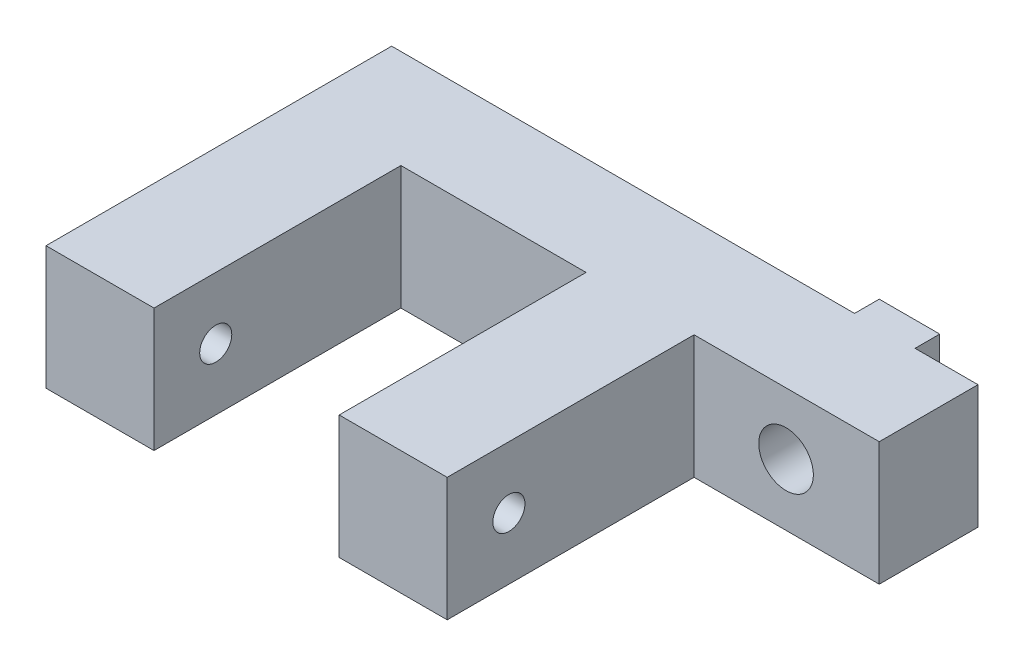
ISO-10303-21;
HEADER;
FILE_DESCRIPTION(('STEP AP214'),'2;1');
FILE_NAME('part.step','',(''),(''),'','','');
FILE_SCHEMA(('AUTOMOTIVE_DESIGN { 1 0 10303 214 1 1 1 1 }'));
ENDSEC;
DATA;
#1=APPLICATION_CONTEXT('core data for automotive mechanical design processes');
#2=APPLICATION_PROTOCOL_DEFINITION('international standard','automotive_design',2000,#1);
#3=PRODUCT_CONTEXT('',#1,'mechanical');
#4=PRODUCT('Part','Part','',(#3));
#5=PRODUCT_RELATED_PRODUCT_CATEGORY('part','',(#4));
#6=PRODUCT_DEFINITION_FORMATION('','',#4);
#7=PRODUCT_DEFINITION_CONTEXT('part definition',#1,'design');
#8=PRODUCT_DEFINITION('design','',#6,#7);
#9=PRODUCT_DEFINITION_SHAPE('','',#8);
#10=(LENGTH_UNIT() NAMED_UNIT(*) SI_UNIT(.MILLI.,.METRE.));
#11=(NAMED_UNIT(*) PLANE_ANGLE_UNIT() SI_UNIT($,.RADIAN.));
#12=(NAMED_UNIT(*) SI_UNIT($,.STERADIAN.) SOLID_ANGLE_UNIT());
#13=UNCERTAINTY_MEASURE_WITH_UNIT(LENGTH_MEASURE(1.E-05),#10,'distance_accuracy_value','');
#14=(GEOMETRIC_REPRESENTATION_CONTEXT(3) GLOBAL_UNCERTAINTY_ASSIGNED_CONTEXT((#13)) GLOBAL_UNIT_ASSIGNED_CONTEXT((#10,
#11,#12)) REPRESENTATION_CONTEXT('',''));
#15=CARTESIAN_POINT('',(0.,0.,0.));
#16=DIRECTION('',(0.,0.,1.));
#17=DIRECTION('',(1.,0.,0.));
#18=AXIS2_PLACEMENT_3D('',#15,#16,#17);
#19=CARTESIAN_POINT('',(41.275,6.35,12.7));
#20=DIRECTION('',(0.,0.,-1.));
#21=DIRECTION('',(-1.,0.,0.));
#22=AXIS2_PLACEMENT_3D('',#19,#20,#21);
#23=PLANE('',#22);
#24=CARTESIAN_POINT('',(50.7365,0.,12.7));
#25=DIRECTION('',(0.,0.,-1.));
#26=DIRECTION('',(-1.,0.,0.));
#27=AXIS2_PLACEMENT_3D('',#24,#25,#26);
#28=CIRCLE('',#27,2.80669999999999);
#29=CARTESIAN_POINT('',(47.9298,0.,12.7));
#30=VERTEX_POINT('',#29);
#31=EDGE_CURVE('E307',#30,#30,#28,.T.);
#32=ORIENTED_EDGE('',*,*,#31,.T.);
#33=EDGE_LOOP('',(#32));
#34=FACE_BOUND('',#33,.T.);
#35=DIRECTION('',(1.,0.,0.));
#36=VECTOR('',#35,1.);
#37=CARTESIAN_POINT('',(41.275,-6.35,12.7));
#38=LINE('',#37,#36);
#39=CARTESIAN_POINT('',(41.275,-6.35,12.7));
#40=VERTEX_POINT('',#39);
#41=CARTESIAN_POINT('',(60.325,-6.35,12.7));
#42=VERTEX_POINT('',#41);
#43=EDGE_CURVE('E134',#40,#42,#38,.T.);
#44=ORIENTED_EDGE('',*,*,#43,.T.);
#45=DIRECTION('',(0.,-1.,0.));
#46=VECTOR('',#45,1.);
#47=CARTESIAN_POINT('',(60.325,6.35,12.7));
#48=LINE('',#47,#46);
#49=CARTESIAN_POINT('',(60.325,6.35,12.7));
#50=VERTEX_POINT('',#49);
#51=EDGE_CURVE('E11',#50,#42,#48,.T.);
#52=ORIENTED_EDGE('',*,*,#51,.F.);
#53=DIRECTION('',(1.,0.,0.));
#54=VECTOR('',#53,1.);
#55=CARTESIAN_POINT('',(41.275,6.35,12.7));
#56=LINE('',#55,#54);
#57=CARTESIAN_POINT('',(41.275,6.35,12.7));
#58=VERTEX_POINT('',#57);
#59=EDGE_CURVE('E178',#58,#50,#56,.T.);
#60=ORIENTED_EDGE('',*,*,#59,.F.);
#61=DIRECTION('',(0.,-1.,0.));
#62=VECTOR('',#61,1.);
#63=CARTESIAN_POINT('',(41.275,6.35,12.7));
#64=LINE('',#63,#62);
#65=EDGE_CURVE('E147',#58,#40,#64,.T.);
#66=ORIENTED_EDGE('',*,*,#65,.T.);
#67=EDGE_LOOP('',(#44,#52,#60,#66));
#68=FACE_BOUND('',#67,.T.);
#69=ADVANCED_FACE('F30',(#34,#68),#23,.F.);
#70=CARTESIAN_POINT('',(60.325,6.35,12.7));
#71=DIRECTION('',(-1.,0.,0.));
#72=DIRECTION('',(0.,0.,1.));
#73=AXIS2_PLACEMENT_3D('',#70,#71,#72);
#74=PLANE('',#73);
#75=DIRECTION('',(0.,0.,-1.));
#76=VECTOR('',#75,1.);
#77=CARTESIAN_POINT('',(60.325,-6.35,12.7));
#78=LINE('',#77,#76);
#79=CARTESIAN_POINT('',(60.325,-6.35,2.54));
#80=VERTEX_POINT('',#79);
#81=EDGE_CURVE('E130',#42,#80,#78,.T.);
#82=ORIENTED_EDGE('',*,*,#81,.T.);
#83=DIRECTION('',(0.,-1.,0.));
#84=VECTOR('',#83,1.);
#85=CARTESIAN_POINT('',(60.325,6.35,2.54));
#86=LINE('',#85,#84);
#87=CARTESIAN_POINT('',(60.325,6.35,2.54));
#88=VERTEX_POINT('',#87);
#89=EDGE_CURVE('E37',#88,#80,#86,.T.);
#90=ORIENTED_EDGE('',*,*,#89,.F.);
#91=DIRECTION('',(0.,0.,-1.));
#92=VECTOR('',#91,1.);
#93=CARTESIAN_POINT('',(60.325,6.35,12.7));
#94=LINE('',#93,#92);
#95=EDGE_CURVE('E143',#50,#88,#94,.T.);
#96=ORIENTED_EDGE('',*,*,#95,.F.);
#97=ORIENTED_EDGE('',*,*,#51,.T.);
#98=EDGE_LOOP('',(#82,#90,#96,#97));
#99=FACE_BOUND('',#98,.T.);
#100=ADVANCED_FACE('F142',(#99),#74,.F.);
#101=CARTESIAN_POINT('',(53.848,6.35,2.54));
#102=DIRECTION('',(0.,0.,1.));
#103=DIRECTION('',(1.,0.,0.));
#104=AXIS2_PLACEMENT_3D('',#101,#102,#103);
#105=PLANE('',#104);
#106=DIRECTION('',(-1.,0.,0.));
#107=VECTOR('',#106,1.);
#108=CARTESIAN_POINT('',(53.848,-6.35,2.54));
#109=LINE('',#108,#107);
#110=CARTESIAN_POINT('',(53.848,-6.35,2.54));
#111=VERTEX_POINT('',#110);
#112=EDGE_CURVE('E136',#80,#111,#109,.T.);
#113=ORIENTED_EDGE('',*,*,#112,.T.);
#114=DIRECTION('',(0.,-1.,0.));
#115=VECTOR('',#114,1.);
#116=CARTESIAN_POINT('',(53.848,6.35,2.54));
#117=LINE('',#116,#115);
#118=CARTESIAN_POINT('',(53.848,6.35,2.54));
#119=VERTEX_POINT('',#118);
#120=EDGE_CURVE('E234',#119,#111,#117,.T.);
#121=ORIENTED_EDGE('',*,*,#120,.F.);
#122=DIRECTION('',(-1.,0.,0.));
#123=VECTOR('',#122,1.);
#124=CARTESIAN_POINT('',(53.848,6.35,2.54));
#125=LINE('',#124,#123);
#126=EDGE_CURVE('E181',#88,#119,#125,.T.);
#127=ORIENTED_EDGE('',*,*,#126,.F.);
#128=ORIENTED_EDGE('',*,*,#89,.T.);
#129=EDGE_LOOP('',(#113,#121,#127,#128));
#130=FACE_BOUND('',#129,.T.);
#131=ADVANCED_FACE('F238',(#130),#105,.F.);
#132=CARTESIAN_POINT('',(53.848,6.35,0.));
#133=DIRECTION('',(-1.,0.,0.));
#134=DIRECTION('',(0.,0.,1.));
#135=AXIS2_PLACEMENT_3D('',#132,#133,#134);
#136=PLANE('',#135);
#137=DIRECTION('',(0.,0.,-1.));
#138=VECTOR('',#137,1.);
#139=CARTESIAN_POINT('',(53.848,-6.35,0.));
#140=LINE('',#139,#138);
#141=CARTESIAN_POINT('',(53.848,-6.35,0.));
#142=VERTEX_POINT('',#141);
#143=EDGE_CURVE('E156',#111,#142,#140,.T.);
#144=ORIENTED_EDGE('',*,*,#143,.T.);
#145=DIRECTION('',(0.,-1.,0.));
#146=VECTOR('',#145,1.);
#147=CARTESIAN_POINT('',(53.848,6.35,0.));
#148=LINE('',#147,#146);
#149=CARTESIAN_POINT('',(53.848,6.35,0.));
#150=VERTEX_POINT('',#149);
#151=EDGE_CURVE('E231',#150,#142,#148,.T.);
#152=ORIENTED_EDGE('',*,*,#151,.F.);
#153=DIRECTION('',(0.,0.,-1.));
#154=VECTOR('',#153,1.);
#155=CARTESIAN_POINT('',(53.848,6.35,0.));
#156=LINE('',#155,#154);
#157=EDGE_CURVE('E183',#119,#150,#156,.T.);
#158=ORIENTED_EDGE('',*,*,#157,.F.);
#159=ORIENTED_EDGE('',*,*,#120,.T.);
#160=EDGE_LOOP('',(#144,#152,#158,#159));
#161=FACE_BOUND('',#160,.T.);
#162=ADVANCED_FACE('F246',(#161),#136,.F.);
#163=CARTESIAN_POINT('',(47.625,6.35,0.));
#164=DIRECTION('',(0.,0.,1.));
#165=DIRECTION('',(1.,0.,0.));
#166=AXIS2_PLACEMENT_3D('',#163,#164,#165);
#167=PLANE('',#166);
#168=CARTESIAN_POINT('',(50.7365,0.,0.));
#169=DIRECTION('',(0.,0.,-1.));
#170=DIRECTION('',(-1.,0.,0.));
#171=AXIS2_PLACEMENT_3D('',#168,#169,#170);
#172=CIRCLE('',#171,2.80669999999999);
#173=CARTESIAN_POINT('',(47.9298,0.,0.));
#174=VERTEX_POINT('',#173);
#175=EDGE_CURVE('E310',#174,#174,#172,.T.);
#176=ORIENTED_EDGE('',*,*,#175,.F.);
#177=EDGE_LOOP('',(#176));
#178=FACE_BOUND('',#177,.T.);
#179=DIRECTION('',(-1.,0.,0.));
#180=VECTOR('',#179,1.);
#181=CARTESIAN_POINT('',(47.625,-6.35,0.));
#182=LINE('',#181,#180);
#183=CARTESIAN_POINT('',(47.625,-6.35,0.));
#184=VERTEX_POINT('',#183);
#185=EDGE_CURVE('E158',#142,#184,#182,.T.);
#186=ORIENTED_EDGE('',*,*,#185,.T.);
#187=DIRECTION('',(0.,-1.,0.));
#188=VECTOR('',#187,1.);
#189=CARTESIAN_POINT('',(47.625,6.35,0.));
#190=LINE('',#189,#188);
#191=CARTESIAN_POINT('',(47.625,6.35,0.));
#192=VERTEX_POINT('',#191);
#193=EDGE_CURVE('E228',#192,#184,#190,.T.);
#194=ORIENTED_EDGE('',*,*,#193,.F.);
#195=DIRECTION('',(-1.,0.,0.));
#196=VECTOR('',#195,1.);
#197=CARTESIAN_POINT('',(47.625,6.35,0.));
#198=LINE('',#197,#196);
#199=EDGE_CURVE('E185',#150,#192,#198,.T.);
#200=ORIENTED_EDGE('',*,*,#199,.F.);
#201=ORIENTED_EDGE('',*,*,#151,.T.);
#202=EDGE_LOOP('',(#186,#194,#200,#201));
#203=FACE_BOUND('',#202,.T.);
#204=ADVANCED_FACE('F249',(#178,#203),#167,.F.);
#205=CARTESIAN_POINT('',(47.625,6.35,2.54));
#206=DIRECTION('',(1.,0.,0.));
#207=DIRECTION('',(0.,0.,-1.));
#208=AXIS2_PLACEMENT_3D('',#205,#206,#207);
#209=PLANE('',#208);
#210=DIRECTION('',(0.,0.,1.));
#211=VECTOR('',#210,1.);
#212=CARTESIAN_POINT('',(47.625,-6.35,2.54));
#213=LINE('',#212,#211);
#214=CARTESIAN_POINT('',(47.625,-6.35,2.54));
#215=VERTEX_POINT('',#214);
#216=EDGE_CURVE('E160',#184,#215,#213,.T.);
#217=ORIENTED_EDGE('',*,*,#216,.T.);
#218=DIRECTION('',(0.,-1.,0.));
#219=VECTOR('',#218,1.);
#220=CARTESIAN_POINT('',(47.625,6.35,2.54));
#221=LINE('',#220,#219);
#222=CARTESIAN_POINT('',(47.625,6.35,2.54));
#223=VERTEX_POINT('',#222);
#224=EDGE_CURVE('E225',#223,#215,#221,.T.);
#225=ORIENTED_EDGE('',*,*,#224,.F.);
#226=DIRECTION('',(0.,0.,1.));
#227=VECTOR('',#226,1.);
#228=CARTESIAN_POINT('',(47.625,6.35,2.54));
#229=LINE('',#228,#227);
#230=EDGE_CURVE('E187',#192,#223,#229,.T.);
#231=ORIENTED_EDGE('',*,*,#230,.F.);
#232=ORIENTED_EDGE('',*,*,#193,.T.);
#233=EDGE_LOOP('',(#217,#225,#231,#232));
#234=FACE_BOUND('',#233,.T.);
#235=ADVANCED_FACE('F254',(#234),#209,.F.);
#236=CARTESIAN_POINT('',(0.,6.35,2.54));
#237=DIRECTION('',(0.,0.,1.));
#238=DIRECTION('',(1.,0.,0.));
#239=AXIS2_PLACEMENT_3D('',#236,#237,#238);
#240=PLANE('',#239);
#241=DIRECTION('',(-1.,0.,0.));
#242=VECTOR('',#241,1.);
#243=CARTESIAN_POINT('',(0.,-6.35,2.54));
#244=LINE('',#243,#242);
#245=CARTESIAN_POINT('',(0.,-6.35,2.54));
#246=VERTEX_POINT('',#245);
#247=EDGE_CURVE('E162',#215,#246,#244,.T.);
#248=ORIENTED_EDGE('',*,*,#247,.T.);
#249=DIRECTION('',(0.,-1.,0.));
#250=VECTOR('',#249,1.);
#251=CARTESIAN_POINT('',(0.,6.35,2.54));
#252=LINE('',#251,#250);
#253=CARTESIAN_POINT('',(0.,6.35,2.54));
#254=VERTEX_POINT('',#253);
#255=EDGE_CURVE('E222',#254,#246,#252,.T.);
#256=ORIENTED_EDGE('',*,*,#255,.F.);
#257=DIRECTION('',(-1.,0.,0.));
#258=VECTOR('',#257,1.);
#259=CARTESIAN_POINT('',(0.,6.35,2.54));
#260=LINE('',#259,#258);
#261=EDGE_CURVE('E189',#223,#254,#260,.T.);
#262=ORIENTED_EDGE('',*,*,#261,.F.);
#263=ORIENTED_EDGE('',*,*,#224,.T.);
#264=EDGE_LOOP('',(#248,#256,#262,#263));
#265=FACE_BOUND('',#264,.T.);
#266=ADVANCED_FACE('F260',(#265),#240,.F.);
#267=CARTESIAN_POINT('',(0.,6.35,38.1));
#268=DIRECTION('',(1.,0.,0.));
#269=DIRECTION('',(0.,0.,-1.));
#270=AXIS2_PLACEMENT_3D('',#267,#268,#269);
#271=PLANE('',#270);
#272=CARTESIAN_POINT('',(0.,0.,31.75));
#273=DIRECTION('',(1.,0.,0.));
#274=DIRECTION('',(0.,0.,-1.));
#275=AXIS2_PLACEMENT_3D('',#272,#273,#274);
#276=CIRCLE('',#275,1.64999999999999);
#277=CARTESIAN_POINT('',(0.,0.,30.1));
#278=VERTEX_POINT('',#277);
#279=EDGE_CURVE('E309',#278,#278,#276,.T.);
#280=ORIENTED_EDGE('',*,*,#279,.T.);
#281=EDGE_LOOP('',(#280));
#282=FACE_BOUND('',#281,.T.);
#283=DIRECTION('',(0.,0.,1.));
#284=VECTOR('',#283,1.);
#285=CARTESIAN_POINT('',(0.,-6.35,38.1));
#286=LINE('',#285,#284);
#287=CARTESIAN_POINT('',(0.,-6.35,38.1));
#288=VERTEX_POINT('',#287);
#289=EDGE_CURVE('E164',#246,#288,#286,.T.);
#290=ORIENTED_EDGE('',*,*,#289,.T.);
#291=DIRECTION('',(0.,-1.,0.));
#292=VECTOR('',#291,1.);
#293=CARTESIAN_POINT('',(0.,6.35,38.1));
#294=LINE('',#293,#292);
#295=CARTESIAN_POINT('',(0.,6.35,38.1));
#296=VERTEX_POINT('',#295);
#297=EDGE_CURVE('E219',#296,#288,#294,.T.);
#298=ORIENTED_EDGE('',*,*,#297,.F.);
#299=DIRECTION('',(0.,0.,1.));
#300=VECTOR('',#299,1.);
#301=CARTESIAN_POINT('',(0.,6.35,38.1));
#302=LINE('',#301,#300);
#303=EDGE_CURVE('E191',#254,#296,#302,.T.);
#304=ORIENTED_EDGE('',*,*,#303,.F.);
#305=ORIENTED_EDGE('',*,*,#255,.T.);
#306=EDGE_LOOP('',(#290,#298,#304,#305));
#307=FACE_BOUND('',#306,.T.);
#308=ADVANCED_FACE('F264',(#282,#307),#271,.F.);
#309=CARTESIAN_POINT('',(11.1125,6.35,38.1));
#310=DIRECTION('',(0.,0.,-1.));
#311=DIRECTION('',(-1.,0.,0.));
#312=AXIS2_PLACEMENT_3D('',#309,#310,#311);
#313=PLANE('',#312);
#314=DIRECTION('',(1.,0.,0.));
#315=VECTOR('',#314,1.);
#316=CARTESIAN_POINT('',(11.1125,-6.35,38.1));
#317=LINE('',#316,#315);
#318=CARTESIAN_POINT('',(11.1125,-6.35,38.1));
#319=VERTEX_POINT('',#318);
#320=EDGE_CURVE('E166',#288,#319,#317,.T.);
#321=ORIENTED_EDGE('',*,*,#320,.T.);
#322=DIRECTION('',(0.,-1.,0.));
#323=VECTOR('',#322,1.);
#324=CARTESIAN_POINT('',(11.1125,6.35,38.1));
#325=LINE('',#324,#323);
#326=CARTESIAN_POINT('',(11.1125,6.35,38.1));
#327=VERTEX_POINT('',#326);
#328=EDGE_CURVE('E216',#327,#319,#325,.T.);
#329=ORIENTED_EDGE('',*,*,#328,.F.);
#330=DIRECTION('',(1.,0.,0.));
#331=VECTOR('',#330,1.);
#332=CARTESIAN_POINT('',(11.1125,6.35,38.1));
#333=LINE('',#332,#331);
#334=EDGE_CURVE('E193',#296,#327,#333,.T.);
#335=ORIENTED_EDGE('',*,*,#334,.F.);
#336=ORIENTED_EDGE('',*,*,#297,.T.);
#337=EDGE_LOOP('',(#321,#329,#335,#336));
#338=FACE_BOUND('',#337,.T.);
#339=ADVANCED_FACE('F269',(#338),#313,.F.);
#340=CARTESIAN_POINT('',(11.1125,6.35,12.7));
#341=DIRECTION('',(-1.,0.,0.));
#342=DIRECTION('',(0.,0.,1.));
#343=AXIS2_PLACEMENT_3D('',#340,#341,#342);
#344=PLANE('',#343);
#345=CARTESIAN_POINT('',(11.1125,0.,31.75));
#346=DIRECTION('',(-1.,0.,0.));
#347=DIRECTION('',(0.,0.,1.));
#348=AXIS2_PLACEMENT_3D('',#345,#346,#347);
#349=CIRCLE('',#348,1.64999999999999);
#350=CARTESIAN_POINT('',(11.1125,0.,33.4));
#351=VERTEX_POINT('',#350);
#352=EDGE_CURVE('E151',#351,#351,#349,.T.);
#353=ORIENTED_EDGE('',*,*,#352,.T.);
#354=EDGE_LOOP('',(#353));
#355=FACE_BOUND('',#354,.T.);
#356=DIRECTION('',(0.,0.,-1.));
#357=VECTOR('',#356,1.);
#358=CARTESIAN_POINT('',(11.1125,-6.35,12.7));
#359=LINE('',#358,#357);
#360=CARTESIAN_POINT('',(11.1125,-6.35,12.7));
#361=VERTEX_POINT('',#360);
#362=EDGE_CURVE('E168',#319,#361,#359,.T.);
#363=ORIENTED_EDGE('',*,*,#362,.T.);
#364=DIRECTION('',(0.,-1.,0.));
#365=VECTOR('',#364,1.);
#366=CARTESIAN_POINT('',(11.1125,6.35,12.7));
#367=LINE('',#366,#365);
#368=CARTESIAN_POINT('',(11.1125,6.35,12.7));
#369=VERTEX_POINT('',#368);
#370=EDGE_CURVE('E213',#369,#361,#367,.T.);
#371=ORIENTED_EDGE('',*,*,#370,.F.);
#372=DIRECTION('',(0.,0.,-1.));
#373=VECTOR('',#372,1.);
#374=CARTESIAN_POINT('',(11.1125,6.35,12.7));
#375=LINE('',#374,#373);
#376=EDGE_CURVE('E195',#327,#369,#375,.T.);
#377=ORIENTED_EDGE('',*,*,#376,.F.);
#378=ORIENTED_EDGE('',*,*,#328,.T.);
#379=EDGE_LOOP('',(#363,#371,#377,#378));
#380=FACE_BOUND('',#379,.T.);
#381=ADVANCED_FACE('F275',(#355,#380),#344,.F.);
#382=CARTESIAN_POINT('',(30.1625,6.35,12.7));
#383=DIRECTION('',(0.,0.,-1.));
#384=DIRECTION('',(-1.,0.,0.));
#385=AXIS2_PLACEMENT_3D('',#382,#383,#384);
#386=PLANE('',#385);
#387=DIRECTION('',(1.,0.,0.));
#388=VECTOR('',#387,1.);
#389=CARTESIAN_POINT('',(30.1625,-6.35,12.7));
#390=LINE('',#389,#388);
#391=CARTESIAN_POINT('',(30.1625,-6.35,12.7));
#392=VERTEX_POINT('',#391);
#393=EDGE_CURVE('E170',#361,#392,#390,.T.);
#394=ORIENTED_EDGE('',*,*,#393,.T.);
#395=DIRECTION('',(0.,-1.,0.));
#396=VECTOR('',#395,1.);
#397=CARTESIAN_POINT('',(30.1625,6.35,12.7));
#398=LINE('',#397,#396);
#399=CARTESIAN_POINT('',(30.1625,6.35,12.7));
#400=VERTEX_POINT('',#399);
#401=EDGE_CURVE('E210',#400,#392,#398,.T.);
#402=ORIENTED_EDGE('',*,*,#401,.F.);
#403=DIRECTION('',(1.,0.,0.));
#404=VECTOR('',#403,1.);
#405=CARTESIAN_POINT('',(30.1625,6.35,12.7));
#406=LINE('',#405,#404);
#407=EDGE_CURVE('E197',#369,#400,#406,.T.);
#408=ORIENTED_EDGE('',*,*,#407,.F.);
#409=ORIENTED_EDGE('',*,*,#370,.T.);
#410=EDGE_LOOP('',(#394,#402,#408,#409));
#411=FACE_BOUND('',#410,.T.);
#412=ADVANCED_FACE('F279',(#411),#386,.F.);
#413=CARTESIAN_POINT('',(30.1625,6.35,38.1));
#414=DIRECTION('',(1.,0.,0.));
#415=DIRECTION('',(0.,0.,-1.));
#416=AXIS2_PLACEMENT_3D('',#413,#414,#415);
#417=PLANE('',#416);
#418=CARTESIAN_POINT('',(30.1625,0.,31.75));
#419=DIRECTION('',(1.,0.,0.));
#420=DIRECTION('',(0.,0.,-1.));
#421=AXIS2_PLACEMENT_3D('',#418,#419,#420);
#422=CIRCLE('',#421,1.64999999999999);
#423=CARTESIAN_POINT('',(30.1625,0.,30.1));
#424=VERTEX_POINT('',#423);
#425=EDGE_CURVE('E148',#424,#424,#422,.T.);
#426=ORIENTED_EDGE('',*,*,#425,.T.);
#427=EDGE_LOOP('',(#426));
#428=FACE_BOUND('',#427,.T.);
#429=DIRECTION('',(0.,0.,1.));
#430=VECTOR('',#429,1.);
#431=CARTESIAN_POINT('',(30.1625,-6.35,38.1));
#432=LINE('',#431,#430);
#433=CARTESIAN_POINT('',(30.1625,-6.35,38.1));
#434=VERTEX_POINT('',#433);
#435=EDGE_CURVE('E172',#392,#434,#432,.T.);
#436=ORIENTED_EDGE('',*,*,#435,.T.);
#437=DIRECTION('',(0.,-1.,0.));
#438=VECTOR('',#437,1.);
#439=CARTESIAN_POINT('',(30.1625,6.35,38.1));
#440=LINE('',#439,#438);
#441=CARTESIAN_POINT('',(30.1625,6.35,38.1));
#442=VERTEX_POINT('',#441);
#443=EDGE_CURVE('E207',#442,#434,#440,.T.);
#444=ORIENTED_EDGE('',*,*,#443,.F.);
#445=DIRECTION('',(0.,0.,1.));
#446=VECTOR('',#445,1.);
#447=CARTESIAN_POINT('',(30.1625,6.35,38.1));
#448=LINE('',#447,#446);
#449=EDGE_CURVE('E199',#400,#442,#448,.T.);
#450=ORIENTED_EDGE('',*,*,#449,.F.);
#451=ORIENTED_EDGE('',*,*,#401,.T.);
#452=EDGE_LOOP('',(#436,#444,#450,#451));
#453=FACE_BOUND('',#452,.T.);
#454=ADVANCED_FACE('F284',(#428,#453),#417,.F.);
#455=CARTESIAN_POINT('',(41.275,6.35,38.1));
#456=DIRECTION('',(0.,0.,-1.));
#457=DIRECTION('',(-1.,0.,0.));
#458=AXIS2_PLACEMENT_3D('',#455,#456,#457);
#459=PLANE('',#458);
#460=DIRECTION('',(1.,0.,0.));
#461=VECTOR('',#460,1.);
#462=CARTESIAN_POINT('',(41.275,-6.35,38.1));
#463=LINE('',#462,#461);
#464=CARTESIAN_POINT('',(41.275,-6.35,38.1));
#465=VERTEX_POINT('',#464);
#466=EDGE_CURVE('E174',#434,#465,#463,.T.);
#467=ORIENTED_EDGE('',*,*,#466,.T.);
#468=DIRECTION('',(0.,-1.,0.));
#469=VECTOR('',#468,1.);
#470=CARTESIAN_POINT('',(41.275,6.35,38.1));
#471=LINE('',#470,#469);
#472=CARTESIAN_POINT('',(41.275,6.35,38.1));
#473=VERTEX_POINT('',#472);
#474=EDGE_CURVE('E204',#473,#465,#471,.T.);
#475=ORIENTED_EDGE('',*,*,#474,.F.);
#476=DIRECTION('',(1.,0.,0.));
#477=VECTOR('',#476,1.);
#478=CARTESIAN_POINT('',(41.275,6.35,38.1));
#479=LINE('',#478,#477);
#480=EDGE_CURVE('E49',#442,#473,#479,.T.);
#481=ORIENTED_EDGE('',*,*,#480,.F.);
#482=ORIENTED_EDGE('',*,*,#443,.T.);
#483=EDGE_LOOP('',(#467,#475,#481,#482));
#484=FACE_BOUND('',#483,.T.);
#485=ADVANCED_FACE('F287',(#484),#459,.F.);
#486=CARTESIAN_POINT('',(41.275,6.35,12.7));
#487=DIRECTION('',(-1.,0.,0.));
#488=DIRECTION('',(0.,0.,1.));
#489=AXIS2_PLACEMENT_3D('',#486,#487,#488);
#490=PLANE('',#489);
#491=CARTESIAN_POINT('',(41.275,0.,31.75));
#492=DIRECTION('',(1.,0.,0.));
#493=DIRECTION('',(0.,0.,-1.));
#494=AXIS2_PLACEMENT_3D('',#491,#492,#493);
#495=CIRCLE('',#494,1.64999999999999);
#496=CARTESIAN_POINT('',(41.275,0.,30.1));
#497=VERTEX_POINT('',#496);
#498=EDGE_CURVE('E313',#497,#497,#495,.T.);
#499=ORIENTED_EDGE('',*,*,#498,.F.);
#500=EDGE_LOOP('',(#499));
#501=FACE_BOUND('',#500,.T.);
#502=DIRECTION('',(0.,0.,-1.));
#503=VECTOR('',#502,1.);
#504=CARTESIAN_POINT('',(41.275,-6.35,12.7));
#505=LINE('',#504,#503);
#506=EDGE_CURVE('E176',#465,#40,#505,.T.);
#507=ORIENTED_EDGE('',*,*,#506,.T.);
#508=ORIENTED_EDGE('',*,*,#65,.F.);
#509=DIRECTION('',(0.,0.,-1.));
#510=VECTOR('',#509,1.);
#511=CARTESIAN_POINT('',(41.275,6.35,12.7));
#512=LINE('',#511,#510);
#513=EDGE_CURVE('E44',#473,#58,#512,.T.);
#514=ORIENTED_EDGE('',*,*,#513,.F.);
#515=ORIENTED_EDGE('',*,*,#474,.T.);
#516=EDGE_LOOP('',(#507,#508,#514,#515));
#517=FACE_BOUND('',#516,.T.);
#518=ADVANCED_FACE('F289',(#501,#517),#490,.F.);
#519=CARTESIAN_POINT('',(60.325,6.35,12.7));
#520=DIRECTION('',(0.,1.,0.));
#521=DIRECTION('',(0.,0.,1.));
#522=AXIS2_PLACEMENT_3D('',#519,#520,#521);
#523=PLANE('',#522);
#524=ORIENTED_EDGE('',*,*,#59,.T.);
#525=ORIENTED_EDGE('',*,*,#95,.T.);
#526=ORIENTED_EDGE('',*,*,#126,.T.);
#527=ORIENTED_EDGE('',*,*,#157,.T.);
#528=ORIENTED_EDGE('',*,*,#199,.T.);
#529=ORIENTED_EDGE('',*,*,#230,.T.);
#530=ORIENTED_EDGE('',*,*,#261,.T.);
#531=ORIENTED_EDGE('',*,*,#303,.T.);
#532=ORIENTED_EDGE('',*,*,#334,.T.);
#533=ORIENTED_EDGE('',*,*,#376,.T.);
#534=ORIENTED_EDGE('',*,*,#407,.T.);
#535=ORIENTED_EDGE('',*,*,#449,.T.);
#536=ORIENTED_EDGE('',*,*,#480,.T.);
#537=ORIENTED_EDGE('',*,*,#513,.T.);
#538=EDGE_LOOP('',(#524,#525,#526,#527,#528,#529,#530,#531,#532,#533,#534,#535,#536,#537));
#539=FACE_BOUND('',#538,.T.);
#540=ADVANCED_FACE('F241',(#539),#523,.T.);
#541=CARTESIAN_POINT('',(60.325,-6.35,12.7));
#542=DIRECTION('',(0.,1.,0.));
#543=DIRECTION('',(0.,0.,1.));
#544=AXIS2_PLACEMENT_3D('',#541,#542,#543);
#545=PLANE('',#544);
#546=ORIENTED_EDGE('',*,*,#43,.F.);
#547=ORIENTED_EDGE('',*,*,#506,.F.);
#548=ORIENTED_EDGE('',*,*,#466,.F.);
#549=ORIENTED_EDGE('',*,*,#435,.F.);
#550=ORIENTED_EDGE('',*,*,#393,.F.);
#551=ORIENTED_EDGE('',*,*,#362,.F.);
#552=ORIENTED_EDGE('',*,*,#320,.F.);
#553=ORIENTED_EDGE('',*,*,#289,.F.);
#554=ORIENTED_EDGE('',*,*,#247,.F.);
#555=ORIENTED_EDGE('',*,*,#216,.F.);
#556=ORIENTED_EDGE('',*,*,#185,.F.);
#557=ORIENTED_EDGE('',*,*,#143,.F.);
#558=ORIENTED_EDGE('',*,*,#112,.F.);
#559=ORIENTED_EDGE('',*,*,#81,.F.);
#560=EDGE_LOOP('',(#546,#547,#548,#549,#550,#551,#552,#553,#554,#555,#556,#557,#558,#559));
#561=FACE_BOUND('',#560,.T.);
#562=ADVANCED_FACE('F131',(#561),#545,.F.);
#563=CARTESIAN_POINT('',(41.275,0.,31.75));
#564=DIRECTION('',(1.,0.,0.));
#565=DIRECTION('',(0.,0.,-1.));
#566=AXIS2_PLACEMENT_3D('',#563,#564,#565);
#567=CYLINDRICAL_SURFACE('',#566,1.64999999999999);
#568=ORIENTED_EDGE('',*,*,#498,.T.);
#569=EDGE_LOOP('',(#568));
#570=FACE_BOUND('',#569,.T.);
#571=ORIENTED_EDGE('',*,*,#425,.F.);
#572=EDGE_LOOP('',(#571));
#573=FACE_BOUND('',#572,.T.);
#574=ADVANCED_FACE('F326',(#570,#573),#567,.F.);
#575=ORIENTED_EDGE('',*,*,#279,.F.);
#576=EDGE_LOOP('',(#575));
#577=FACE_BOUND('',#576,.T.);
#578=ORIENTED_EDGE('',*,*,#352,.F.);
#579=EDGE_LOOP('',(#578));
#580=FACE_BOUND('',#579,.T.);
#581=ADVANCED_FACE('F323',(#577,#580),#567,.F.);
#582=CARTESIAN_POINT('',(50.7365,0.,0.));
#583=DIRECTION('',(0.,0.,-1.));
#584=DIRECTION('',(-1.,0.,0.));
#585=AXIS2_PLACEMENT_3D('',#582,#583,#584);
#586=CYLINDRICAL_SURFACE('',#585,2.80669999999999);
#587=ORIENTED_EDGE('',*,*,#31,.F.);
#588=EDGE_LOOP('',(#587));
#589=FACE_BOUND('',#588,.T.);
#590=ORIENTED_EDGE('',*,*,#175,.T.);
#591=EDGE_LOOP('',(#590));
#592=FACE_BOUND('',#591,.T.);
#593=ADVANCED_FACE('F325',(#589,#592),#586,.F.);
#594=CLOSED_SHELL('',(#69,#100,#131,#162,#204,#235,#266,#308,#339,#381,#412,#454,#485,#518,#540,
#562,#574,#581,#593));
#595=MANIFOLD_SOLID_BREP('B2',#594);
#596=ADVANCED_BREP_SHAPE_REPRESENTATION('',(#18,#595),#14);
#597=SHAPE_DEFINITION_REPRESENTATION(#9,#596);
ENDSEC;
END-ISO-10303-21;
